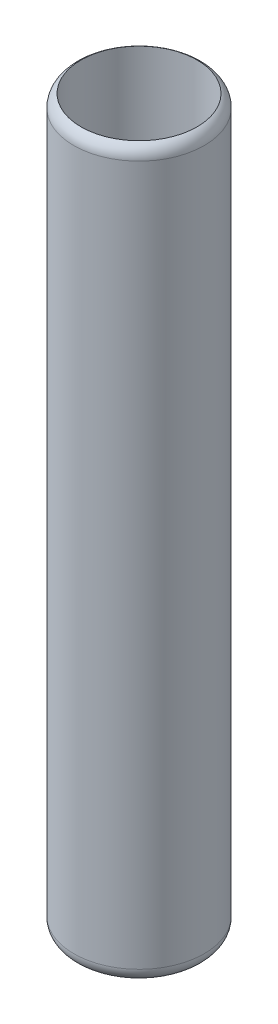
ISO-10303-21;
HEADER;
FILE_DESCRIPTION(('STEP AP214'),'2;1');
FILE_NAME('part.step','',(''),(''),'','','');
FILE_SCHEMA(('AUTOMOTIVE_DESIGN { 1 0 10303 214 1 1 1 1 }'));
ENDSEC;
DATA;
#1=APPLICATION_CONTEXT('core data for automotive mechanical design processes');
#2=APPLICATION_PROTOCOL_DEFINITION('international standard','automotive_design',2000,#1);
#3=PRODUCT_CONTEXT('',#1,'mechanical');
#4=PRODUCT('Part','Part','',(#3));
#5=PRODUCT_RELATED_PRODUCT_CATEGORY('part','',(#4));
#6=PRODUCT_DEFINITION_FORMATION('','',#4);
#7=PRODUCT_DEFINITION_CONTEXT('part definition',#1,'design');
#8=PRODUCT_DEFINITION('design','',#6,#7);
#9=PRODUCT_DEFINITION_SHAPE('','',#8);
#10=(LENGTH_UNIT() NAMED_UNIT(*) SI_UNIT(.MILLI.,.METRE.));
#11=(NAMED_UNIT(*) PLANE_ANGLE_UNIT() SI_UNIT($,.RADIAN.));
#12=(NAMED_UNIT(*) SI_UNIT($,.STERADIAN.) SOLID_ANGLE_UNIT());
#13=UNCERTAINTY_MEASURE_WITH_UNIT(LENGTH_MEASURE(1.E-05),#10,'distance_accuracy_value','');
#14=(GEOMETRIC_REPRESENTATION_CONTEXT(3) GLOBAL_UNCERTAINTY_ASSIGNED_CONTEXT((#13)) GLOBAL_UNIT_ASSIGNED_CONTEXT((#10,
#11,#12)) REPRESENTATION_CONTEXT('',''));
#15=CARTESIAN_POINT('',(0.,0.,0.));
#16=DIRECTION('',(0.,0.,1.));
#17=DIRECTION('',(1.,0.,0.));
#18=AXIS2_PLACEMENT_3D('',#15,#16,#17);
#19=CARTESIAN_POINT('',(0.,50.,0.));
#20=DIRECTION('',(0.,-1.,0.));
#21=DIRECTION('',(0.,0.,-1.));
#22=AXIS2_PLACEMENT_3D('',#19,#20,#21);
#23=CYLINDRICAL_SURFACE('',#22,4.5);
#24=CARTESIAN_POINT('',(0.,0.866025403784436,0.));
#25=DIRECTION('',(0.,-1.,0.));
#26=DIRECTION('',(0.,0.,-1.));
#27=AXIS2_PLACEMENT_3D('',#24,#25,#26);
#28=CIRCLE('',#27,4.5);
#29=CARTESIAN_POINT('',(0.,0.866025403784436,-4.5));
#30=VERTEX_POINT('',#29);
#31=EDGE_CURVE('E10',#30,#30,#28,.F.);
#32=ORIENTED_EDGE('',*,*,#31,.T.);
#33=EDGE_LOOP('',(#32));
#34=FACE_BOUND('',#33,.T.);
#35=CARTESIAN_POINT('',(0.,49.1339745962156,0.));
#36=DIRECTION('',(0.,1.,0.));
#37=DIRECTION('',(0.,0.,1.));
#38=AXIS2_PLACEMENT_3D('',#35,#36,#37);
#39=CIRCLE('',#38,4.5);
#40=CARTESIAN_POINT('',(0.,49.1339745962156,4.5));
#41=VERTEX_POINT('',#40);
#42=EDGE_CURVE('E42',#41,#41,#39,.F.);
#43=ORIENTED_EDGE('',*,*,#42,.T.);
#44=EDGE_LOOP('',(#43));
#45=FACE_BOUND('',#44,.T.);
#46=ADVANCED_FACE('F35',(#34,#45),#23,.T.);
#47=CARTESIAN_POINT('',(0.,0.,0.));
#48=DIRECTION('',(0.,1.,0.));
#49=DIRECTION('',(0.,0.,1.));
#50=AXIS2_PLACEMENT_3D('',#47,#48,#49);
#51=CYLINDRICAL_SURFACE('',#50,4.);
#52=CARTESIAN_POINT('',(0.,0.,0.));
#53=DIRECTION('',(0.,1.,0.));
#54=DIRECTION('',(0.,0.,1.));
#55=AXIS2_PLACEMENT_3D('',#52,#53,#54);
#56=CIRCLE('',#55,4.);
#57=CARTESIAN_POINT('',(0.,0.,4.));
#58=VERTEX_POINT('',#57);
#59=EDGE_CURVE('E46',#58,#58,#56,.T.);
#60=ORIENTED_EDGE('',*,*,#59,.F.);
#61=EDGE_LOOP('',(#60));
#62=FACE_BOUND('',#61,.T.);
#63=CARTESIAN_POINT('',(0.,50.,0.));
#64=DIRECTION('',(0.,1.,0.));
#65=DIRECTION('',(0.,0.,1.));
#66=AXIS2_PLACEMENT_3D('',#63,#64,#65);
#67=CIRCLE('',#66,4.);
#68=CARTESIAN_POINT('',(0.,50.,4.));
#69=VERTEX_POINT('',#68);
#70=EDGE_CURVE('E50',#69,#69,#67,.T.);
#71=ORIENTED_EDGE('',*,*,#70,.T.);
#72=EDGE_LOOP('',(#71));
#73=FACE_BOUND('',#72,.T.);
#74=ADVANCED_FACE('F56',(#62,#73),#51,.F.);
#75=CARTESIAN_POINT('',(0.,0.866025403784438,0.));
#76=DIRECTION('',(0.,-1.,0.));
#77=DIRECTION('',(0.,0.,-1.));
#78=AXIS2_PLACEMENT_3D('',#75,#76,#77);
#79=TOROIDAL_SURFACE('',#78,3.5,1.);
#80=ORIENTED_EDGE('',*,*,#59,.T.);
#81=EDGE_LOOP('',(#80));
#82=FACE_BOUND('',#81,.T.);
#83=ORIENTED_EDGE('',*,*,#31,.F.);
#84=EDGE_LOOP('',(#83));
#85=FACE_BOUND('',#84,.T.);
#86=ADVANCED_FACE('F59',(#82,#85),#79,.T.);
#87=CARTESIAN_POINT('',(0.,49.1339745962156,0.));
#88=DIRECTION('',(0.,1.,0.));
#89=DIRECTION('',(0.,0.,1.));
#90=AXIS2_PLACEMENT_3D('',#87,#88,#89);
#91=TOROIDAL_SURFACE('',#90,3.5,1.);
#92=ORIENTED_EDGE('',*,*,#42,.F.);
#93=EDGE_LOOP('',(#92));
#94=FACE_BOUND('',#93,.T.);
#95=ORIENTED_EDGE('',*,*,#70,.F.);
#96=EDGE_LOOP('',(#95));
#97=FACE_BOUND('',#96,.T.);
#98=ADVANCED_FACE('F37',(#94,#97),#91,.T.);
#99=CLOSED_SHELL('',(#46,#74,#86,#98));
#100=MANIFOLD_SOLID_BREP('B2',#99);
#101=ADVANCED_BREP_SHAPE_REPRESENTATION('',(#18,#100),#14);
#102=SHAPE_DEFINITION_REPRESENTATION(#9,#101);
ENDSEC;
END-ISO-10303-21;
